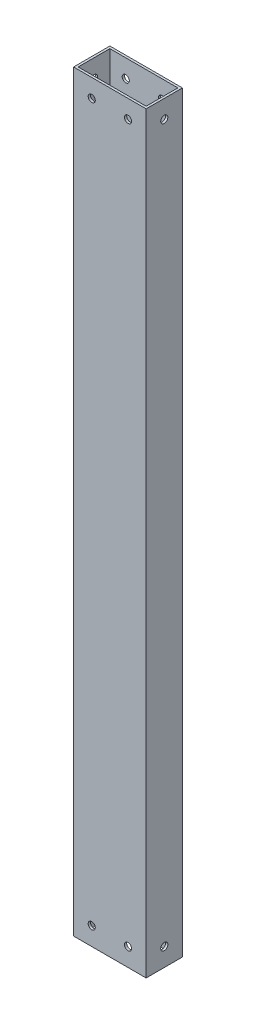
ISO-10303-21;
HEADER;
FILE_DESCRIPTION(('STEP AP214'),'2;1');
FILE_NAME('part.step','',(''),(''),'','','');
FILE_SCHEMA(('AUTOMOTIVE_DESIGN { 1 0 10303 214 1 1 1 1 }'));
ENDSEC;
DATA;
#1=APPLICATION_CONTEXT('core data for automotive mechanical design processes');
#2=APPLICATION_PROTOCOL_DEFINITION('international standard','automotive_design',2000,#1);
#3=PRODUCT_CONTEXT('',#1,'mechanical');
#4=PRODUCT('Part','Part','',(#3));
#5=PRODUCT_RELATED_PRODUCT_CATEGORY('part','',(#4));
#6=PRODUCT_DEFINITION_FORMATION('','',#4);
#7=PRODUCT_DEFINITION_CONTEXT('part definition',#1,'design');
#8=PRODUCT_DEFINITION('design','',#6,#7);
#9=PRODUCT_DEFINITION_SHAPE('','',#8);
#10=(LENGTH_UNIT() NAMED_UNIT(*) SI_UNIT(.MILLI.,.METRE.));
#11=(NAMED_UNIT(*) PLANE_ANGLE_UNIT() SI_UNIT($,.RADIAN.));
#12=(NAMED_UNIT(*) SI_UNIT($,.STERADIAN.) SOLID_ANGLE_UNIT());
#13=UNCERTAINTY_MEASURE_WITH_UNIT(LENGTH_MEASURE(1.E-05),#10,'distance_accuracy_value','');
#14=(GEOMETRIC_REPRESENTATION_CONTEXT(3) GLOBAL_UNCERTAINTY_ASSIGNED_CONTEXT((#13)) GLOBAL_UNIT_ASSIGNED_CONTEXT((#10,
#11,#12)) REPRESENTATION_CONTEXT('',''));
#15=CARTESIAN_POINT('',(0.,0.,0.));
#16=DIRECTION('',(0.,0.,1.));
#17=DIRECTION('',(1.,0.,0.));
#18=AXIS2_PLACEMENT_3D('',#15,#16,#17);
#19=CARTESIAN_POINT('',(-25.4,263.525,12.7));
#20=DIRECTION('',(0.,-1.,0.));
#21=DIRECTION('',(0.,0.,-1.));
#22=AXIS2_PLACEMENT_3D('',#19,#20,#21);
#23=PLANE('',#22);
#24=DIRECTION('',(-1.,0.,0.));
#25=VECTOR('',#24,1.);
#26=CARTESIAN_POINT('',(-25.4,263.525,-12.7));
#27=LINE('',#26,#25);
#28=CARTESIAN_POINT('',(25.4,263.525,-12.7));
#29=VERTEX_POINT('',#28);
#30=CARTESIAN_POINT('',(-25.4,263.525,-12.7));
#31=VERTEX_POINT('',#30);
#32=EDGE_CURVE('E176',#29,#31,#27,.T.);
#33=ORIENTED_EDGE('',*,*,#32,.T.);
#34=DIRECTION('',(0.,0.,-1.));
#35=VECTOR('',#34,1.);
#36=CARTESIAN_POINT('',(-25.4,263.525,12.7));
#37=LINE('',#36,#35);
#38=CARTESIAN_POINT('',(-25.4,263.525,12.7));
#39=VERTEX_POINT('',#38);
#40=EDGE_CURVE('E55',#39,#31,#37,.T.);
#41=ORIENTED_EDGE('',*,*,#40,.F.);
#42=DIRECTION('',(-1.,0.,0.));
#43=VECTOR('',#42,1.);
#44=CARTESIAN_POINT('',(-25.4,263.525,12.7));
#45=LINE('',#44,#43);
#46=CARTESIAN_POINT('',(25.4,263.525,12.7));
#47=VERTEX_POINT('',#46);
#48=EDGE_CURVE('E162',#47,#39,#45,.T.);
#49=ORIENTED_EDGE('',*,*,#48,.F.);
#50=DIRECTION('',(0.,0.,-1.));
#51=VECTOR('',#50,1.);
#52=CARTESIAN_POINT('',(25.4,263.525,12.7));
#53=LINE('',#52,#51);
#54=EDGE_CURVE('E11',#47,#29,#53,.T.);
#55=ORIENTED_EDGE('',*,*,#54,.T.);
#56=EDGE_LOOP('',(#33,#41,#49,#55));
#57=FACE_BOUND('',#56,.T.);
#58=DIRECTION('',(-1.,0.,0.));
#59=VECTOR('',#58,1.);
#60=CARTESIAN_POINT('',(0.,263.525,-11.1125));
#61=LINE('',#60,#59);
#62=CARTESIAN_POINT('',(23.8125,263.525,-11.1125));
#63=VERTEX_POINT('',#62);
#64=CARTESIAN_POINT('',(-23.8125,263.525,-11.1125));
#65=VERTEX_POINT('',#64);
#66=EDGE_CURVE('E127',#63,#65,#61,.T.);
#67=ORIENTED_EDGE('',*,*,#66,.F.);
#68=DIRECTION('',(0.,0.,-1.));
#69=VECTOR('',#68,1.);
#70=CARTESIAN_POINT('',(23.8125,263.525,12.7));
#71=LINE('',#70,#69);
#72=CARTESIAN_POINT('',(23.8125,263.525,11.1125));
#73=VERTEX_POINT('',#72);
#74=EDGE_CURVE('E113',#73,#63,#71,.T.);
#75=ORIENTED_EDGE('',*,*,#74,.F.);
#76=DIRECTION('',(-1.,0.,0.));
#77=VECTOR('',#76,1.);
#78=CARTESIAN_POINT('',(0.,263.525,11.1125));
#79=LINE('',#78,#77);
#80=CARTESIAN_POINT('',(-23.8125,263.525,11.1125));
#81=VERTEX_POINT('',#80);
#82=EDGE_CURVE('E144',#73,#81,#79,.T.);
#83=ORIENTED_EDGE('',*,*,#82,.T.);
#84=DIRECTION('',(0.,0.,-1.));
#85=VECTOR('',#84,1.);
#86=CARTESIAN_POINT('',(-23.8125,263.525,12.7));
#87=LINE('',#86,#85);
#88=EDGE_CURVE('E123',#81,#65,#87,.T.);
#89=ORIENTED_EDGE('',*,*,#88,.T.);
#90=EDGE_LOOP('',(#67,#75,#83,#89));
#91=FACE_BOUND('',#90,.T.);
#92=ADVANCED_FACE('F45',(#57,#91),#23,.F.);
#93=CARTESIAN_POINT('',(-25.4,-263.525,12.7));
#94=DIRECTION('',(0.,1.,0.));
#95=DIRECTION('',(0.,0.,1.));
#96=AXIS2_PLACEMENT_3D('',#93,#94,#95);
#97=PLANE('',#96);
#98=DIRECTION('',(1.,0.,0.));
#99=VECTOR('',#98,1.);
#100=CARTESIAN_POINT('',(-25.4,-263.525,-12.7));
#101=LINE('',#100,#99);
#102=CARTESIAN_POINT('',(-25.4,-263.525,-12.7));
#103=VERTEX_POINT('',#102);
#104=CARTESIAN_POINT('',(25.4,-263.525,-12.7));
#105=VERTEX_POINT('',#104);
#106=EDGE_CURVE('E163',#103,#105,#101,.T.);
#107=ORIENTED_EDGE('',*,*,#106,.T.);
#108=DIRECTION('',(0.,0.,-1.));
#109=VECTOR('',#108,1.);
#110=CARTESIAN_POINT('',(25.4,-263.525,12.7));
#111=LINE('',#110,#109);
#112=CARTESIAN_POINT('',(25.4,-263.525,12.7));
#113=VERTEX_POINT('',#112);
#114=EDGE_CURVE('E172',#113,#105,#111,.T.);
#115=ORIENTED_EDGE('',*,*,#114,.F.);
#116=DIRECTION('',(1.,0.,0.));
#117=VECTOR('',#116,1.);
#118=CARTESIAN_POINT('',(-25.4,-263.525,12.7));
#119=LINE('',#118,#117);
#120=CARTESIAN_POINT('',(-25.4,-263.525,12.7));
#121=VERTEX_POINT('',#120);
#122=EDGE_CURVE('E169',#121,#113,#119,.T.);
#123=ORIENTED_EDGE('',*,*,#122,.F.);
#124=DIRECTION('',(0.,0.,-1.));
#125=VECTOR('',#124,1.);
#126=CARTESIAN_POINT('',(-25.4,-263.525,12.7));
#127=LINE('',#126,#125);
#128=EDGE_CURVE('E187',#121,#103,#127,.T.);
#129=ORIENTED_EDGE('',*,*,#128,.T.);
#130=EDGE_LOOP('',(#107,#115,#123,#129));
#131=FACE_BOUND('',#130,.T.);
#132=DIRECTION('',(1.,0.,0.));
#133=VECTOR('',#132,1.);
#134=CARTESIAN_POINT('',(0.,-263.525,-11.1125));
#135=LINE('',#134,#133);
#136=CARTESIAN_POINT('',(-23.8125,-263.525,-11.1125));
#137=VERTEX_POINT('',#136);
#138=CARTESIAN_POINT('',(23.8125,-263.525,-11.1125));
#139=VERTEX_POINT('',#138);
#140=EDGE_CURVE('E130',#137,#139,#135,.T.);
#141=ORIENTED_EDGE('',*,*,#140,.F.);
#142=DIRECTION('',(0.,0.,-1.));
#143=VECTOR('',#142,1.);
#144=CARTESIAN_POINT('',(-23.8125,-263.525,12.7));
#145=LINE('',#144,#143);
#146=CARTESIAN_POINT('',(-23.8125,-263.525,11.1125));
#147=VERTEX_POINT('',#146);
#148=EDGE_CURVE('E143',#147,#137,#145,.T.);
#149=ORIENTED_EDGE('',*,*,#148,.F.);
#150=DIRECTION('',(1.,0.,0.));
#151=VECTOR('',#150,1.);
#152=CARTESIAN_POINT('',(0.,-263.525,11.1125));
#153=LINE('',#152,#151);
#154=CARTESIAN_POINT('',(23.8125,-263.525,11.1125));
#155=VERTEX_POINT('',#154);
#156=EDGE_CURVE('E70',#147,#155,#153,.T.);
#157=ORIENTED_EDGE('',*,*,#156,.T.);
#158=DIRECTION('',(0.,0.,-1.));
#159=VECTOR('',#158,1.);
#160=CARTESIAN_POINT('',(23.8125,-263.525,12.7));
#161=LINE('',#160,#159);
#162=EDGE_CURVE('E148',#155,#139,#161,.T.);
#163=ORIENTED_EDGE('',*,*,#162,.T.);
#164=EDGE_LOOP('',(#141,#149,#157,#163));
#165=FACE_BOUND('',#164,.T.);
#166=ADVANCED_FACE('F295',(#131,#165),#97,.F.);
#167=CARTESIAN_POINT('',(25.4,-263.525,12.7));
#168=DIRECTION('',(-1.,0.,0.));
#169=DIRECTION('',(0.,0.,1.));
#170=AXIS2_PLACEMENT_3D('',#167,#168,#169);
#171=PLANE('',#170);
#172=CARTESIAN_POINT('',(25.4,-250.825,0.));
#173=DIRECTION('',(1.,0.,0.));
#174=DIRECTION('',(0.,0.,-1.));
#175=AXIS2_PLACEMENT_3D('',#172,#173,#174);
#176=CIRCLE('',#175,2.48920000000001);
#177=CARTESIAN_POINT('',(25.4,-250.825,-2.48920000000001));
#178=VERTEX_POINT('',#177);
#179=EDGE_CURVE('E225',#178,#178,#176,.T.);
#180=ORIENTED_EDGE('',*,*,#179,.F.);
#181=EDGE_LOOP('',(#180));
#182=FACE_BOUND('',#181,.T.);
#183=CARTESIAN_POINT('',(25.4,250.825,0.));
#184=DIRECTION('',(1.,0.,0.));
#185=DIRECTION('',(0.,0.,-1.));
#186=AXIS2_PLACEMENT_3D('',#183,#184,#185);
#187=CIRCLE('',#186,2.48920000000001);
#188=CARTESIAN_POINT('',(25.4,250.825,-2.48920000000001));
#189=VERTEX_POINT('',#188);
#190=EDGE_CURVE('E231',#189,#189,#187,.T.);
#191=ORIENTED_EDGE('',*,*,#190,.F.);
#192=EDGE_LOOP('',(#191));
#193=FACE_BOUND('',#192,.T.);
#194=DIRECTION('',(0.,1.,0.));
#195=VECTOR('',#194,1.);
#196=CARTESIAN_POINT('',(25.4,-263.525,-12.7));
#197=LINE('',#196,#195);
#198=EDGE_CURVE('E122',#105,#29,#197,.T.);
#199=ORIENTED_EDGE('',*,*,#198,.T.);
#200=ORIENTED_EDGE('',*,*,#54,.F.);
#201=DIRECTION('',(0.,1.,0.));
#202=VECTOR('',#201,1.);
#203=CARTESIAN_POINT('',(25.4,-263.525,12.7));
#204=LINE('',#203,#202);
#205=EDGE_CURVE('E158',#113,#47,#204,.T.);
#206=ORIENTED_EDGE('',*,*,#205,.F.);
#207=ORIENTED_EDGE('',*,*,#114,.T.);
#208=EDGE_LOOP('',(#199,#200,#206,#207));
#209=FACE_BOUND('',#208,.T.);
#210=ADVANCED_FACE('F47',(#182,#193,#209),#171,.F.);
#211=CARTESIAN_POINT('',(-25.4,-263.525,12.7));
#212=DIRECTION('',(1.,0.,0.));
#213=DIRECTION('',(0.,0.,-1.));
#214=AXIS2_PLACEMENT_3D('',#211,#212,#213);
#215=PLANE('',#214);
#216=CARTESIAN_POINT('',(-25.4,-250.825,0.));
#217=DIRECTION('',(1.,0.,0.));
#218=DIRECTION('',(0.,0.,-1.));
#219=AXIS2_PLACEMENT_3D('',#216,#217,#218);
#220=CIRCLE('',#219,2.48920000000001);
#221=CARTESIAN_POINT('',(-25.4,-250.825,-2.48920000000001));
#222=VERTEX_POINT('',#221);
#223=EDGE_CURVE('E217',#222,#222,#220,.T.);
#224=ORIENTED_EDGE('',*,*,#223,.T.);
#225=EDGE_LOOP('',(#224));
#226=FACE_BOUND('',#225,.T.);
#227=CARTESIAN_POINT('',(-25.4,250.825,0.));
#228=DIRECTION('',(1.,0.,0.));
#229=DIRECTION('',(0.,0.,-1.));
#230=AXIS2_PLACEMENT_3D('',#227,#228,#229);
#231=CIRCLE('',#230,2.48920000000001);
#232=CARTESIAN_POINT('',(-25.4,250.825,-2.48920000000001));
#233=VERTEX_POINT('',#232);
#234=EDGE_CURVE('E234',#233,#233,#231,.T.);
#235=ORIENTED_EDGE('',*,*,#234,.T.);
#236=EDGE_LOOP('',(#235));
#237=FACE_BOUND('',#236,.T.);
#238=DIRECTION('',(0.,-1.,0.));
#239=VECTOR('',#238,1.);
#240=CARTESIAN_POINT('',(-25.4,-263.525,-12.7));
#241=LINE('',#240,#239);
#242=EDGE_CURVE('E179',#31,#103,#241,.T.);
#243=ORIENTED_EDGE('',*,*,#242,.T.);
#244=ORIENTED_EDGE('',*,*,#128,.F.);
#245=DIRECTION('',(0.,-1.,0.));
#246=VECTOR('',#245,1.);
#247=CARTESIAN_POINT('',(-25.4,-263.525,12.7));
#248=LINE('',#247,#246);
#249=EDGE_CURVE('E166',#39,#121,#248,.T.);
#250=ORIENTED_EDGE('',*,*,#249,.F.);
#251=ORIENTED_EDGE('',*,*,#40,.T.);
#252=EDGE_LOOP('',(#243,#244,#250,#251));
#253=FACE_BOUND('',#252,.T.);
#254=ADVANCED_FACE('F320',(#226,#237,#253),#215,.F.);
#255=CARTESIAN_POINT('',(0.,0.,12.7));
#256=DIRECTION('',(0.,0.,-1.));
#257=DIRECTION('',(-1.,0.,0.));
#258=AXIS2_PLACEMENT_3D('',#255,#256,#257);
#259=PLANE('',#258);
#260=CARTESIAN_POINT('',(-12.7,250.825,12.7));
#261=DIRECTION('',(0.,0.,1.));
#262=DIRECTION('',(-1.,0.,0.));
#263=AXIS2_PLACEMENT_3D('',#260,#261,#262);
#264=CIRCLE('',#263,2.48920000000001);
#265=CARTESIAN_POINT('',(-15.1892,250.825,12.7));
#266=VERTEX_POINT('',#265);
#267=EDGE_CURVE('E260',#266,#266,#264,.T.);
#268=ORIENTED_EDGE('',*,*,#267,.F.);
#269=EDGE_LOOP('',(#268));
#270=FACE_BOUND('',#269,.T.);
#271=CARTESIAN_POINT('',(12.7,250.825,12.7));
#272=DIRECTION('',(0.,0.,1.));
#273=DIRECTION('',(-1.,0.,0.));
#274=AXIS2_PLACEMENT_3D('',#271,#272,#273);
#275=CIRCLE('',#274,2.48920000000001);
#276=CARTESIAN_POINT('',(10.2108,250.825,12.7));
#277=VERTEX_POINT('',#276);
#278=EDGE_CURVE('E251',#277,#277,#275,.T.);
#279=ORIENTED_EDGE('',*,*,#278,.F.);
#280=EDGE_LOOP('',(#279));
#281=FACE_BOUND('',#280,.T.);
#282=CARTESIAN_POINT('',(12.7,-250.825,12.7));
#283=DIRECTION('',(0.,0.,1.));
#284=DIRECTION('',(1.,0.,0.));
#285=AXIS2_PLACEMENT_3D('',#282,#283,#284);
#286=CIRCLE('',#285,2.48920000000001);
#287=CARTESIAN_POINT('',(15.1892,-250.825,12.7));
#288=VERTEX_POINT('',#287);
#289=EDGE_CURVE('E250',#288,#288,#286,.T.);
#290=ORIENTED_EDGE('',*,*,#289,.F.);
#291=EDGE_LOOP('',(#290));
#292=FACE_BOUND('',#291,.T.);
#293=CARTESIAN_POINT('',(-12.7,-250.825,12.7));
#294=DIRECTION('',(0.,0.,1.));
#295=DIRECTION('',(1.,0.,0.));
#296=AXIS2_PLACEMENT_3D('',#293,#294,#295);
#297=CIRCLE('',#296,2.48920000000001);
#298=CARTESIAN_POINT('',(-10.2108,-250.825,12.7));
#299=VERTEX_POINT('',#298);
#300=EDGE_CURVE('E255',#299,#299,#297,.T.);
#301=ORIENTED_EDGE('',*,*,#300,.F.);
#302=EDGE_LOOP('',(#301));
#303=FACE_BOUND('',#302,.T.);
#304=ORIENTED_EDGE('',*,*,#205,.T.);
#305=ORIENTED_EDGE('',*,*,#48,.T.);
#306=ORIENTED_EDGE('',*,*,#249,.T.);
#307=ORIENTED_EDGE('',*,*,#122,.T.);
#308=EDGE_LOOP('',(#304,#305,#306,#307));
#309=FACE_BOUND('',#308,.T.);
#310=ADVANCED_FACE('F322',(#270,#281,#292,#303,#309),#259,.F.);
#311=CARTESIAN_POINT('',(0.,0.,-12.7));
#312=DIRECTION('',(0.,0.,-1.));
#313=DIRECTION('',(-1.,0.,0.));
#314=AXIS2_PLACEMENT_3D('',#311,#312,#313);
#315=PLANE('',#314);
#316=CARTESIAN_POINT('',(-12.7,250.825,-12.7));
#317=DIRECTION('',(0.,0.,1.));
#318=DIRECTION('',(-1.,0.,0.));
#319=AXIS2_PLACEMENT_3D('',#316,#317,#318);
#320=CIRCLE('',#319,2.48920000000001);
#321=CARTESIAN_POINT('',(-15.1892,250.825,-12.7));
#322=VERTEX_POINT('',#321);
#323=EDGE_CURVE('E245',#322,#322,#320,.T.);
#324=ORIENTED_EDGE('',*,*,#323,.T.);
#325=EDGE_LOOP('',(#324));
#326=FACE_BOUND('',#325,.T.);
#327=CARTESIAN_POINT('',(12.7,250.825,-12.7));
#328=DIRECTION('',(0.,0.,1.));
#329=DIRECTION('',(-1.,0.,0.));
#330=AXIS2_PLACEMENT_3D('',#327,#328,#329);
#331=CIRCLE('',#330,2.48920000000001);
#332=CARTESIAN_POINT('',(10.2108,250.825,-12.7));
#333=VERTEX_POINT('',#332);
#334=EDGE_CURVE('E256',#333,#333,#331,.T.);
#335=ORIENTED_EDGE('',*,*,#334,.T.);
#336=EDGE_LOOP('',(#335));
#337=FACE_BOUND('',#336,.T.);
#338=CARTESIAN_POINT('',(12.7,-250.825,-12.7));
#339=DIRECTION('',(0.,0.,1.));
#340=DIRECTION('',(1.,0.,0.));
#341=AXIS2_PLACEMENT_3D('',#338,#339,#340);
#342=CIRCLE('',#341,2.48920000000001);
#343=CARTESIAN_POINT('',(15.1892,-250.825,-12.7));
#344=VERTEX_POINT('',#343);
#345=EDGE_CURVE('E246',#344,#344,#342,.T.);
#346=ORIENTED_EDGE('',*,*,#345,.T.);
#347=EDGE_LOOP('',(#346));
#348=FACE_BOUND('',#347,.T.);
#349=CARTESIAN_POINT('',(-12.7,-250.825,-12.7));
#350=DIRECTION('',(0.,0.,1.));
#351=DIRECTION('',(1.,0.,0.));
#352=AXIS2_PLACEMENT_3D('',#349,#350,#351);
#353=CIRCLE('',#352,2.48920000000001);
#354=CARTESIAN_POINT('',(-10.2108,-250.825,-12.7));
#355=VERTEX_POINT('',#354);
#356=EDGE_CURVE('E199',#355,#355,#353,.T.);
#357=ORIENTED_EDGE('',*,*,#356,.T.);
#358=EDGE_LOOP('',(#357));
#359=FACE_BOUND('',#358,.T.);
#360=ORIENTED_EDGE('',*,*,#198,.F.);
#361=ORIENTED_EDGE('',*,*,#106,.F.);
#362=ORIENTED_EDGE('',*,*,#242,.F.);
#363=ORIENTED_EDGE('',*,*,#32,.F.);
#364=EDGE_LOOP('',(#360,#361,#362,#363));
#365=FACE_BOUND('',#364,.T.);
#366=ADVANCED_FACE('F324',(#326,#337,#348,#359,#365),#315,.T.);
#367=CARTESIAN_POINT('',(23.8125,-263.525,12.7));
#368=DIRECTION('',(-1.,0.,0.));
#369=DIRECTION('',(0.,0.,1.));
#370=AXIS2_PLACEMENT_3D('',#367,#368,#369);
#371=PLANE('',#370);
#372=CARTESIAN_POINT('',(23.8125,-250.825,0.));
#373=DIRECTION('',(-1.,0.,0.));
#374=DIRECTION('',(0.,0.,1.));
#375=AXIS2_PLACEMENT_3D('',#372,#373,#374);
#376=CIRCLE('',#375,2.48920000000001);
#377=CARTESIAN_POINT('',(23.8125,-250.825,2.48920000000001));
#378=VERTEX_POINT('',#377);
#379=EDGE_CURVE('E241',#378,#378,#376,.T.);
#380=ORIENTED_EDGE('',*,*,#379,.F.);
#381=EDGE_LOOP('',(#380));
#382=FACE_BOUND('',#381,.T.);
#383=CARTESIAN_POINT('',(23.8125,250.825,0.));
#384=DIRECTION('',(-1.,0.,0.));
#385=DIRECTION('',(0.,0.,1.));
#386=AXIS2_PLACEMENT_3D('',#383,#384,#385);
#387=CIRCLE('',#386,2.48920000000001);
#388=CARTESIAN_POINT('',(23.8125,250.825,2.48920000000001));
#389=VERTEX_POINT('',#388);
#390=EDGE_CURVE('E216',#389,#389,#387,.T.);
#391=ORIENTED_EDGE('',*,*,#390,.F.);
#392=EDGE_LOOP('',(#391));
#393=FACE_BOUND('',#392,.T.);
#394=DIRECTION('',(0.,1.,0.));
#395=VECTOR('',#394,1.);
#396=CARTESIAN_POINT('',(23.8125,0.,-11.1125));
#397=LINE('',#396,#395);
#398=EDGE_CURVE('E116',#139,#63,#397,.T.);
#399=ORIENTED_EDGE('',*,*,#398,.F.);
#400=ORIENTED_EDGE('',*,*,#162,.F.);
#401=DIRECTION('',(0.,1.,0.));
#402=VECTOR('',#401,1.);
#403=CARTESIAN_POINT('',(23.8125,0.,11.1125));
#404=LINE('',#403,#402);
#405=EDGE_CURVE('E63',#155,#73,#404,.T.);
#406=ORIENTED_EDGE('',*,*,#405,.T.);
#407=ORIENTED_EDGE('',*,*,#74,.T.);
#408=EDGE_LOOP('',(#399,#400,#406,#407));
#409=FACE_BOUND('',#408,.T.);
#410=ADVANCED_FACE('F115',(#382,#393,#409),#371,.T.);
#411=CARTESIAN_POINT('',(-23.8125,-263.525,12.7));
#412=DIRECTION('',(1.,0.,0.));
#413=DIRECTION('',(0.,0.,-1.));
#414=AXIS2_PLACEMENT_3D('',#411,#412,#413);
#415=PLANE('',#414);
#416=CARTESIAN_POINT('',(-23.8125,-250.825,0.));
#417=DIRECTION('',(1.,0.,0.));
#418=DIRECTION('',(0.,0.,-1.));
#419=AXIS2_PLACEMENT_3D('',#416,#417,#418);
#420=CIRCLE('',#419,2.48920000000001);
#421=CARTESIAN_POINT('',(-23.8125,-250.825,-2.48920000000001));
#422=VERTEX_POINT('',#421);
#423=EDGE_CURVE('E49',#422,#422,#420,.T.);
#424=ORIENTED_EDGE('',*,*,#423,.F.);
#425=EDGE_LOOP('',(#424));
#426=FACE_BOUND('',#425,.T.);
#427=CARTESIAN_POINT('',(-23.8125,250.825,0.));
#428=DIRECTION('',(1.,0.,0.));
#429=DIRECTION('',(0.,0.,-1.));
#430=AXIS2_PLACEMENT_3D('',#427,#428,#429);
#431=CIRCLE('',#430,2.48920000000001);
#432=CARTESIAN_POINT('',(-23.8125,250.825,-2.48920000000001));
#433=VERTEX_POINT('',#432);
#434=EDGE_CURVE('E213',#433,#433,#431,.T.);
#435=ORIENTED_EDGE('',*,*,#434,.F.);
#436=EDGE_LOOP('',(#435));
#437=FACE_BOUND('',#436,.T.);
#438=DIRECTION('',(0.,-1.,0.));
#439=VECTOR('',#438,1.);
#440=CARTESIAN_POINT('',(-23.8125,0.,-11.1125));
#441=LINE('',#440,#439);
#442=EDGE_CURVE('E136',#65,#137,#441,.T.);
#443=ORIENTED_EDGE('',*,*,#442,.F.);
#444=ORIENTED_EDGE('',*,*,#88,.F.);
#445=DIRECTION('',(0.,-1.,0.));
#446=VECTOR('',#445,1.);
#447=CARTESIAN_POINT('',(-23.8125,0.,11.1125));
#448=LINE('',#447,#446);
#449=EDGE_CURVE('E147',#81,#147,#448,.T.);
#450=ORIENTED_EDGE('',*,*,#449,.T.);
#451=ORIENTED_EDGE('',*,*,#148,.T.);
#452=EDGE_LOOP('',(#443,#444,#450,#451));
#453=FACE_BOUND('',#452,.T.);
#454=ADVANCED_FACE('F293',(#426,#437,#453),#415,.T.);
#455=CARTESIAN_POINT('',(0.,0.,11.1125));
#456=DIRECTION('',(0.,0.,-1.));
#457=DIRECTION('',(-1.,0.,0.));
#458=AXIS2_PLACEMENT_3D('',#455,#456,#457);
#459=PLANE('',#458);
#460=CARTESIAN_POINT('',(-12.7,250.825,11.1125));
#461=DIRECTION('',(0.,0.,-1.));
#462=DIRECTION('',(-1.,0.,0.));
#463=AXIS2_PLACEMENT_3D('',#460,#461,#462);
#464=CIRCLE('',#463,2.48920000000001);
#465=CARTESIAN_POINT('',(-15.1892,250.825,11.1125));
#466=VERTEX_POINT('',#465);
#467=EDGE_CURVE('E132',#466,#466,#464,.T.);
#468=ORIENTED_EDGE('',*,*,#467,.F.);
#469=EDGE_LOOP('',(#468));
#470=FACE_BOUND('',#469,.T.);
#471=CARTESIAN_POINT('',(12.7,250.825,11.1125));
#472=DIRECTION('',(0.,0.,-1.));
#473=DIRECTION('',(-1.,0.,0.));
#474=AXIS2_PLACEMENT_3D('',#471,#472,#473);
#475=CIRCLE('',#474,2.48920000000001);
#476=CARTESIAN_POINT('',(10.2108,250.825,11.1125));
#477=VERTEX_POINT('',#476);
#478=EDGE_CURVE('E209',#477,#477,#475,.T.);
#479=ORIENTED_EDGE('',*,*,#478,.F.);
#480=EDGE_LOOP('',(#479));
#481=FACE_BOUND('',#480,.T.);
#482=CARTESIAN_POINT('',(12.7,-250.825,11.1125));
#483=DIRECTION('',(0.,0.,-1.));
#484=DIRECTION('',(-1.,0.,0.));
#485=AXIS2_PLACEMENT_3D('',#482,#483,#484);
#486=CIRCLE('',#485,2.48920000000001);
#487=CARTESIAN_POINT('',(10.2108,-250.825,11.1125));
#488=VERTEX_POINT('',#487);
#489=EDGE_CURVE('E204',#488,#488,#486,.T.);
#490=ORIENTED_EDGE('',*,*,#489,.F.);
#491=EDGE_LOOP('',(#490));
#492=FACE_BOUND('',#491,.T.);
#493=CARTESIAN_POINT('',(-12.7,-250.825,11.1125));
#494=DIRECTION('',(0.,0.,-1.));
#495=DIRECTION('',(-1.,0.,0.));
#496=AXIS2_PLACEMENT_3D('',#493,#494,#495);
#497=CIRCLE('',#496,2.48920000000001);
#498=CARTESIAN_POINT('',(-15.1892,-250.825,11.1125));
#499=VERTEX_POINT('',#498);
#500=EDGE_CURVE('E198',#499,#499,#497,.T.);
#501=ORIENTED_EDGE('',*,*,#500,.F.);
#502=EDGE_LOOP('',(#501));
#503=FACE_BOUND('',#502,.T.);
#504=ORIENTED_EDGE('',*,*,#405,.F.);
#505=ORIENTED_EDGE('',*,*,#156,.F.);
#506=ORIENTED_EDGE('',*,*,#449,.F.);
#507=ORIENTED_EDGE('',*,*,#82,.F.);
#508=EDGE_LOOP('',(#504,#505,#506,#507));
#509=FACE_BOUND('',#508,.T.);
#510=ADVANCED_FACE('F296',(#470,#481,#492,#503,#509),#459,.T.);
#511=CARTESIAN_POINT('',(0.,0.,-11.1125));
#512=DIRECTION('',(0.,0.,-1.));
#513=DIRECTION('',(-1.,0.,0.));
#514=AXIS2_PLACEMENT_3D('',#511,#512,#513);
#515=PLANE('',#514);
#516=CARTESIAN_POINT('',(-12.7,250.825,-11.1125));
#517=DIRECTION('',(0.,0.,-1.));
#518=DIRECTION('',(-1.,0.,0.));
#519=AXIS2_PLACEMENT_3D('',#516,#517,#518);
#520=CIRCLE('',#519,2.48920000000001);
#521=CARTESIAN_POINT('',(-15.1892,250.825,-11.1125));
#522=VERTEX_POINT('',#521);
#523=EDGE_CURVE('E210',#522,#522,#520,.T.);
#524=ORIENTED_EDGE('',*,*,#523,.T.);
#525=EDGE_LOOP('',(#524));
#526=FACE_BOUND('',#525,.T.);
#527=CARTESIAN_POINT('',(12.7,250.825,-11.1125));
#528=DIRECTION('',(0.,0.,-1.));
#529=DIRECTION('',(-1.,0.,0.));
#530=AXIS2_PLACEMENT_3D('',#527,#528,#529);
#531=CIRCLE('',#530,2.48920000000001);
#532=CARTESIAN_POINT('',(10.2108,250.825,-11.1125));
#533=VERTEX_POINT('',#532);
#534=EDGE_CURVE('E205',#533,#533,#531,.T.);
#535=ORIENTED_EDGE('',*,*,#534,.T.);
#536=EDGE_LOOP('',(#535));
#537=FACE_BOUND('',#536,.T.);
#538=CARTESIAN_POINT('',(12.7,-250.825,-11.1125));
#539=DIRECTION('',(0.,0.,-1.));
#540=DIRECTION('',(-1.,0.,0.));
#541=AXIS2_PLACEMENT_3D('',#538,#539,#540);
#542=CIRCLE('',#541,2.48920000000001);
#543=CARTESIAN_POINT('',(10.2108,-250.825,-11.1125));
#544=VERTEX_POINT('',#543);
#545=EDGE_CURVE('E200',#544,#544,#542,.T.);
#546=ORIENTED_EDGE('',*,*,#545,.T.);
#547=EDGE_LOOP('',(#546));
#548=FACE_BOUND('',#547,.T.);
#549=CARTESIAN_POINT('',(-12.7,-250.825,-11.1125));
#550=DIRECTION('',(0.,0.,-1.));
#551=DIRECTION('',(-1.,0.,0.));
#552=AXIS2_PLACEMENT_3D('',#549,#550,#551);
#553=CIRCLE('',#552,2.48920000000001);
#554=CARTESIAN_POINT('',(-15.1892,-250.825,-11.1125));
#555=VERTEX_POINT('',#554);
#556=EDGE_CURVE('E194',#555,#555,#553,.T.);
#557=ORIENTED_EDGE('',*,*,#556,.T.);
#558=EDGE_LOOP('',(#557));
#559=FACE_BOUND('',#558,.T.);
#560=ORIENTED_EDGE('',*,*,#398,.T.);
#561=ORIENTED_EDGE('',*,*,#66,.T.);
#562=ORIENTED_EDGE('',*,*,#442,.T.);
#563=ORIENTED_EDGE('',*,*,#140,.T.);
#564=EDGE_LOOP('',(#560,#561,#562,#563));
#565=FACE_BOUND('',#564,.T.);
#566=ADVANCED_FACE('F126',(#526,#537,#548,#559,#565),#515,.F.);
#567=CARTESIAN_POINT('',(-12.7,-250.825,-12.7));
#568=DIRECTION('',(0.,0.,1.));
#569=DIRECTION('',(1.,0.,0.));
#570=AXIS2_PLACEMENT_3D('',#567,#568,#569);
#571=CYLINDRICAL_SURFACE('',#570,2.48920000000001);
#572=ORIENTED_EDGE('',*,*,#356,.F.);
#573=EDGE_LOOP('',(#572));
#574=FACE_BOUND('',#573,.T.);
#575=ORIENTED_EDGE('',*,*,#556,.F.);
#576=EDGE_LOOP('',(#575));
#577=FACE_BOUND('',#576,.T.);
#578=ADVANCED_FACE('F304',(#574,#577),#571,.F.);
#579=CARTESIAN_POINT('',(12.7,-250.825,-12.7));
#580=DIRECTION('',(0.,0.,1.));
#581=DIRECTION('',(1.,0.,0.));
#582=AXIS2_PLACEMENT_3D('',#579,#580,#581);
#583=CYLINDRICAL_SURFACE('',#582,2.48920000000001);
#584=ORIENTED_EDGE('',*,*,#345,.F.);
#585=EDGE_LOOP('',(#584));
#586=FACE_BOUND('',#585,.T.);
#587=ORIENTED_EDGE('',*,*,#545,.F.);
#588=EDGE_LOOP('',(#587));
#589=FACE_BOUND('',#588,.T.);
#590=ADVANCED_FACE('F404',(#586,#589),#583,.F.);
#591=CARTESIAN_POINT('',(12.7,250.825,-12.7));
#592=DIRECTION('',(0.,0.,1.));
#593=DIRECTION('',(1.,0.,0.));
#594=AXIS2_PLACEMENT_3D('',#591,#592,#593);
#595=CYLINDRICAL_SURFACE('',#594,2.48920000000001);
#596=ORIENTED_EDGE('',*,*,#334,.F.);
#597=EDGE_LOOP('',(#596));
#598=FACE_BOUND('',#597,.T.);
#599=ORIENTED_EDGE('',*,*,#534,.F.);
#600=EDGE_LOOP('',(#599));
#601=FACE_BOUND('',#600,.T.);
#602=ADVANCED_FACE('F393',(#598,#601),#595,.F.);
#603=CARTESIAN_POINT('',(-12.7,250.825,-12.7));
#604=DIRECTION('',(0.,0.,1.));
#605=DIRECTION('',(1.,0.,0.));
#606=AXIS2_PLACEMENT_3D('',#603,#604,#605);
#607=CYLINDRICAL_SURFACE('',#606,2.48920000000001);
#608=ORIENTED_EDGE('',*,*,#323,.F.);
#609=EDGE_LOOP('',(#608));
#610=FACE_BOUND('',#609,.T.);
#611=ORIENTED_EDGE('',*,*,#523,.F.);
#612=EDGE_LOOP('',(#611));
#613=FACE_BOUND('',#612,.T.);
#614=ADVANCED_FACE('F383',(#610,#613),#607,.F.);
#615=ORIENTED_EDGE('',*,*,#500,.T.);
#616=EDGE_LOOP('',(#615));
#617=FACE_BOUND('',#616,.T.);
#618=ORIENTED_EDGE('',*,*,#300,.T.);
#619=EDGE_LOOP('',(#618));
#620=FACE_BOUND('',#619,.T.);
#621=ADVANCED_FACE('F397',(#617,#620),#571,.F.);
#622=ORIENTED_EDGE('',*,*,#489,.T.);
#623=EDGE_LOOP('',(#622));
#624=FACE_BOUND('',#623,.T.);
#625=ORIENTED_EDGE('',*,*,#289,.T.);
#626=EDGE_LOOP('',(#625));
#627=FACE_BOUND('',#626,.T.);
#628=ADVANCED_FACE('F390',(#624,#627),#583,.F.);
#629=ORIENTED_EDGE('',*,*,#478,.T.);
#630=EDGE_LOOP('',(#629));
#631=FACE_BOUND('',#630,.T.);
#632=ORIENTED_EDGE('',*,*,#278,.T.);
#633=EDGE_LOOP('',(#632));
#634=FACE_BOUND('',#633,.T.);
#635=ADVANCED_FACE('F380',(#631,#634),#595,.F.);
#636=ORIENTED_EDGE('',*,*,#467,.T.);
#637=EDGE_LOOP('',(#636));
#638=FACE_BOUND('',#637,.T.);
#639=ORIENTED_EDGE('',*,*,#267,.T.);
#640=EDGE_LOOP('',(#639));
#641=FACE_BOUND('',#640,.T.);
#642=ADVANCED_FACE('F377',(#638,#641),#607,.F.);
#643=CARTESIAN_POINT('',(-25.4,250.825,0.));
#644=DIRECTION('',(1.,0.,0.));
#645=DIRECTION('',(0.,0.,-1.));
#646=AXIS2_PLACEMENT_3D('',#643,#644,#645);
#647=CYLINDRICAL_SURFACE('',#646,2.48920000000001);
#648=ORIENTED_EDGE('',*,*,#434,.T.);
#649=EDGE_LOOP('',(#648));
#650=FACE_BOUND('',#649,.T.);
#651=ORIENTED_EDGE('',*,*,#234,.F.);
#652=EDGE_LOOP('',(#651));
#653=FACE_BOUND('',#652,.T.);
#654=ADVANCED_FACE('F367',(#650,#653),#647,.F.);
#655=CARTESIAN_POINT('',(-25.4,-250.825,0.));
#656=DIRECTION('',(1.,0.,0.));
#657=DIRECTION('',(0.,0.,-1.));
#658=AXIS2_PLACEMENT_3D('',#655,#656,#657);
#659=CYLINDRICAL_SURFACE('',#658,2.48920000000001);
#660=ORIENTED_EDGE('',*,*,#423,.T.);
#661=EDGE_LOOP('',(#660));
#662=FACE_BOUND('',#661,.T.);
#663=ORIENTED_EDGE('',*,*,#223,.F.);
#664=EDGE_LOOP('',(#663));
#665=FACE_BOUND('',#664,.T.);
#666=ADVANCED_FACE('F364',(#662,#665),#659,.F.);
#667=ORIENTED_EDGE('',*,*,#390,.T.);
#668=EDGE_LOOP('',(#667));
#669=FACE_BOUND('',#668,.T.);
#670=ORIENTED_EDGE('',*,*,#190,.T.);
#671=EDGE_LOOP('',(#670));
#672=FACE_BOUND('',#671,.T.);
#673=ADVANCED_FACE('F361',(#669,#672),#647,.F.);
#674=ORIENTED_EDGE('',*,*,#379,.T.);
#675=EDGE_LOOP('',(#674));
#676=FACE_BOUND('',#675,.T.);
#677=ORIENTED_EDGE('',*,*,#179,.T.);
#678=EDGE_LOOP('',(#677));
#679=FACE_BOUND('',#678,.T.);
#680=ADVANCED_FACE('F363',(#676,#679),#659,.F.);
#681=CLOSED_SHELL('',(#92,#166,#210,#254,#310,#366,#410,#454,#510,#566,#578,#590,#602,#614,#621,
#628,#635,#642,#654,#666,#673,#680));
#682=MANIFOLD_SOLID_BREP('B2',#681);
#683=ADVANCED_BREP_SHAPE_REPRESENTATION('',(#18,#682),#14);
#684=SHAPE_DEFINITION_REPRESENTATION(#9,#683);
ENDSEC;
END-ISO-10303-21;
